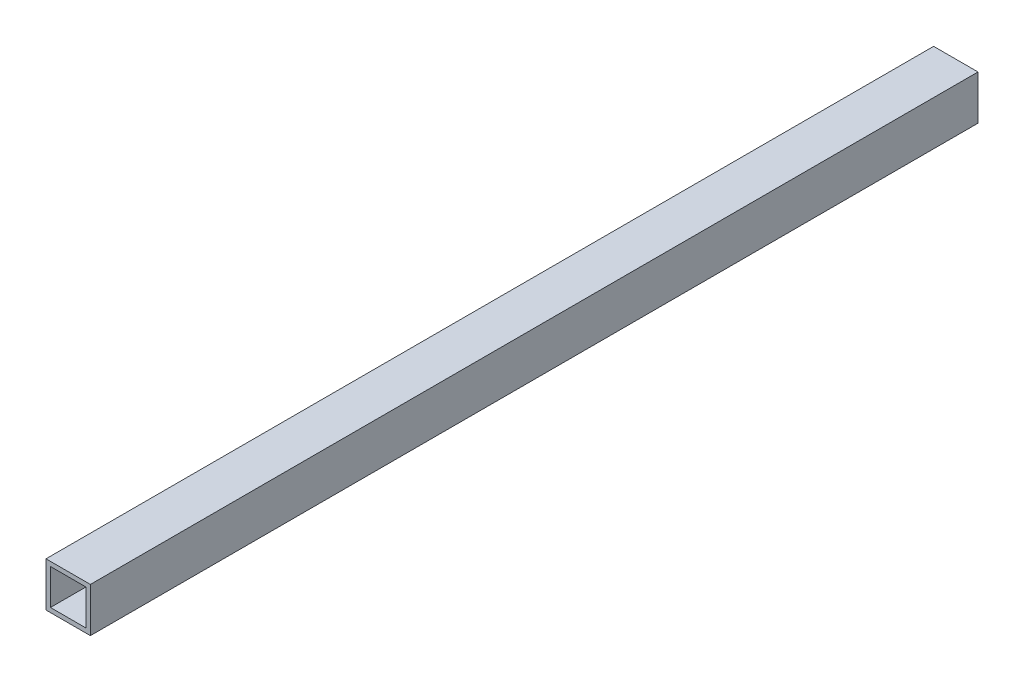
ISO-10303-21;
HEADER;
FILE_DESCRIPTION(('STEP AP214'),'2;1');
FILE_NAME('part.step','',(''),(''),'','','');
FILE_SCHEMA(('AUTOMOTIVE_DESIGN { 1 0 10303 214 1 1 1 1 }'));
ENDSEC;
DATA;
#1=APPLICATION_CONTEXT('core data for automotive mechanical design processes');
#2=APPLICATION_PROTOCOL_DEFINITION('international standard','automotive_design',2000,#1);
#3=PRODUCT_CONTEXT('',#1,'mechanical');
#4=PRODUCT('Part','Part','',(#3));
#5=PRODUCT_RELATED_PRODUCT_CATEGORY('part','',(#4));
#6=PRODUCT_DEFINITION_FORMATION('','',#4);
#7=PRODUCT_DEFINITION_CONTEXT('part definition',#1,'design');
#8=PRODUCT_DEFINITION('design','',#6,#7);
#9=PRODUCT_DEFINITION_SHAPE('','',#8);
#10=(LENGTH_UNIT() NAMED_UNIT(*) SI_UNIT(.MILLI.,.METRE.));
#11=(NAMED_UNIT(*) PLANE_ANGLE_UNIT() SI_UNIT($,.RADIAN.));
#12=(NAMED_UNIT(*) SI_UNIT($,.STERADIAN.) SOLID_ANGLE_UNIT());
#13=UNCERTAINTY_MEASURE_WITH_UNIT(LENGTH_MEASURE(1.E-05),#10,'distance_accuracy_value','');
#14=(GEOMETRIC_REPRESENTATION_CONTEXT(3) GLOBAL_UNCERTAINTY_ASSIGNED_CONTEXT((#13)) GLOBAL_UNIT_ASSIGNED_CONTEXT((#10,
#11,#12)) REPRESENTATION_CONTEXT('',''));
#15=CARTESIAN_POINT('',(0.,0.,0.));
#16=DIRECTION('',(0.,0.,1.));
#17=DIRECTION('',(1.,0.,0.));
#18=AXIS2_PLACEMENT_3D('',#15,#16,#17);
#19=CARTESIAN_POINT('',(0.,0.,300.));
#20=DIRECTION('',(0.,0.,1.));
#21=DIRECTION('',(1.,0.,0.));
#22=AXIS2_PLACEMENT_3D('',#19,#20,#21);
#23=PLANE('',#22);
#24=DIRECTION('',(0.,1.,0.));
#25=VECTOR('',#24,1.);
#26=CARTESIAN_POINT('',(7.5,6.,300.));
#27=LINE('',#26,#25);
#28=CARTESIAN_POINT('',(7.5,-7.5,300.));
#29=VERTEX_POINT('',#28);
#30=CARTESIAN_POINT('',(7.5,7.5,300.));
#31=VERTEX_POINT('',#30);
#32=EDGE_CURVE('E157',#29,#31,#27,.T.);
#33=ORIENTED_EDGE('',*,*,#32,.T.);
#34=DIRECTION('',(-1.,0.,0.));
#35=VECTOR('',#34,1.);
#36=CARTESIAN_POINT('',(-6.,7.5,300.));
#37=LINE('',#36,#35);
#38=CARTESIAN_POINT('',(-7.5,7.5,300.));
#39=VERTEX_POINT('',#38);
#40=EDGE_CURVE('E160',#31,#39,#37,.T.);
#41=ORIENTED_EDGE('',*,*,#40,.T.);
#42=DIRECTION('',(0.,-1.,0.));
#43=VECTOR('',#42,1.);
#44=CARTESIAN_POINT('',(-7.5,6.,300.));
#45=LINE('',#44,#43);
#46=CARTESIAN_POINT('',(-7.5,-7.5,300.));
#47=VERTEX_POINT('',#46);
#48=EDGE_CURVE('E163',#39,#47,#45,.T.);
#49=ORIENTED_EDGE('',*,*,#48,.T.);
#50=DIRECTION('',(1.,0.,0.));
#51=VECTOR('',#50,1.);
#52=CARTESIAN_POINT('',(-6.,-7.5,300.));
#53=LINE('',#52,#51);
#54=EDGE_CURVE('E165',#47,#29,#53,.T.);
#55=ORIENTED_EDGE('',*,*,#54,.T.);
#56=EDGE_LOOP('',(#33,#41,#49,#55));
#57=FACE_BOUND('',#56,.T.);
#58=DIRECTION('',(-1.,0.,0.));
#59=VECTOR('',#58,1.);
#60=CARTESIAN_POINT('',(-6.,6.,300.));
#61=LINE('',#60,#59);
#62=CARTESIAN_POINT('',(6.,6.,300.));
#63=VERTEX_POINT('',#62);
#64=CARTESIAN_POINT('',(-6.,6.,300.));
#65=VERTEX_POINT('',#64);
#66=EDGE_CURVE('E129',#63,#65,#61,.T.);
#67=ORIENTED_EDGE('',*,*,#66,.F.);
#68=DIRECTION('',(0.,1.,0.));
#69=VECTOR('',#68,1.);
#70=CARTESIAN_POINT('',(6.,6.,300.));
#71=LINE('',#70,#69);
#72=CARTESIAN_POINT('',(6.,-6.,300.));
#73=VERTEX_POINT('',#72);
#74=EDGE_CURVE('E121',#73,#63,#71,.T.);
#75=ORIENTED_EDGE('',*,*,#74,.F.);
#76=DIRECTION('',(1.,0.,0.));
#77=VECTOR('',#76,1.);
#78=CARTESIAN_POINT('',(-6.,-6.,300.));
#79=LINE('',#78,#77);
#80=CARTESIAN_POINT('',(-6.,-6.,300.));
#81=VERTEX_POINT('',#80);
#82=EDGE_CURVE('E143',#81,#73,#79,.T.);
#83=ORIENTED_EDGE('',*,*,#82,.F.);
#84=DIRECTION('',(0.,-1.,0.));
#85=VECTOR('',#84,1.);
#86=CARTESIAN_POINT('',(-6.,6.,300.));
#87=LINE('',#86,#85);
#88=EDGE_CURVE('E141',#65,#81,#87,.T.);
#89=ORIENTED_EDGE('',*,*,#88,.F.);
#90=EDGE_LOOP('',(#67,#75,#83,#89));
#91=FACE_BOUND('',#90,.T.);
#92=ADVANCED_FACE('F56',(#57,#91),#23,.T.);
#93=CARTESIAN_POINT('',(0.,0.,0.));
#94=DIRECTION('',(0.,0.,1.));
#95=DIRECTION('',(1.,0.,0.));
#96=AXIS2_PLACEMENT_3D('',#93,#94,#95);
#97=PLANE('',#96);
#98=DIRECTION('',(0.,1.,0.));
#99=VECTOR('',#98,1.);
#100=CARTESIAN_POINT('',(7.5,6.,0.));
#101=LINE('',#100,#99);
#102=CARTESIAN_POINT('',(7.5,-7.5,0.));
#103=VERTEX_POINT('',#102);
#104=CARTESIAN_POINT('',(7.5,7.5,0.));
#105=VERTEX_POINT('',#104);
#106=EDGE_CURVE('E137',#103,#105,#101,.T.);
#107=ORIENTED_EDGE('',*,*,#106,.F.);
#108=DIRECTION('',(1.,0.,0.));
#109=VECTOR('',#108,1.);
#110=CARTESIAN_POINT('',(-6.,-7.5,0.));
#111=LINE('',#110,#109);
#112=CARTESIAN_POINT('',(-7.5,-7.5,0.));
#113=VERTEX_POINT('',#112);
#114=EDGE_CURVE('E161',#113,#103,#111,.T.);
#115=ORIENTED_EDGE('',*,*,#114,.F.);
#116=DIRECTION('',(0.,-1.,0.));
#117=VECTOR('',#116,1.);
#118=CARTESIAN_POINT('',(-7.5,6.,0.));
#119=LINE('',#118,#117);
#120=CARTESIAN_POINT('',(-7.5,7.5,0.));
#121=VERTEX_POINT('',#120);
#122=EDGE_CURVE('E172',#121,#113,#119,.T.);
#123=ORIENTED_EDGE('',*,*,#122,.F.);
#124=DIRECTION('',(-1.,0.,0.));
#125=VECTOR('',#124,1.);
#126=CARTESIAN_POINT('',(-6.,7.5,0.));
#127=LINE('',#126,#125);
#128=EDGE_CURVE('E170',#105,#121,#127,.T.);
#129=ORIENTED_EDGE('',*,*,#128,.F.);
#130=EDGE_LOOP('',(#107,#115,#123,#129));
#131=FACE_BOUND('',#130,.T.);
#132=DIRECTION('',(0.,1.,0.));
#133=VECTOR('',#132,1.);
#134=CARTESIAN_POINT('',(6.,6.,0.));
#135=LINE('',#134,#133);
#136=CARTESIAN_POINT('',(6.,-6.,0.));
#137=VERTEX_POINT('',#136);
#138=CARTESIAN_POINT('',(6.,6.,0.));
#139=VERTEX_POINT('',#138);
#140=EDGE_CURVE('E79',#137,#139,#135,.T.);
#141=ORIENTED_EDGE('',*,*,#140,.T.);
#142=DIRECTION('',(-1.,0.,0.));
#143=VECTOR('',#142,1.);
#144=CARTESIAN_POINT('',(-6.,6.,0.));
#145=LINE('',#144,#143);
#146=CARTESIAN_POINT('',(-6.,6.,0.));
#147=VERTEX_POINT('',#146);
#148=EDGE_CURVE('E136',#139,#147,#145,.T.);
#149=ORIENTED_EDGE('',*,*,#148,.T.);
#150=DIRECTION('',(0.,-1.,0.));
#151=VECTOR('',#150,1.);
#152=CARTESIAN_POINT('',(-6.,6.,0.));
#153=LINE('',#152,#151);
#154=CARTESIAN_POINT('',(-6.,-6.,0.));
#155=VERTEX_POINT('',#154);
#156=EDGE_CURVE('E149',#147,#155,#153,.T.);
#157=ORIENTED_EDGE('',*,*,#156,.T.);
#158=DIRECTION('',(1.,0.,0.));
#159=VECTOR('',#158,1.);
#160=CARTESIAN_POINT('',(-6.,-6.,0.));
#161=LINE('',#160,#159);
#162=EDGE_CURVE('E130',#155,#137,#161,.T.);
#163=ORIENTED_EDGE('',*,*,#162,.T.);
#164=EDGE_LOOP('',(#141,#149,#157,#163));
#165=FACE_BOUND('',#164,.T.);
#166=ADVANCED_FACE('F190',(#131,#165),#97,.F.);
#167=CARTESIAN_POINT('',(7.5,6.,300.));
#168=DIRECTION('',(-1.,0.,0.));
#169=DIRECTION('',(0.,-1.,0.));
#170=AXIS2_PLACEMENT_3D('',#167,#168,#169);
#171=PLANE('',#170);
#172=ORIENTED_EDGE('',*,*,#106,.T.);
#173=DIRECTION('',(0.,0.,-1.));
#174=VECTOR('',#173,1.);
#175=CARTESIAN_POINT('',(7.5,7.5,300.));
#176=LINE('',#175,#174);
#177=EDGE_CURVE('E12',#31,#105,#176,.T.);
#178=ORIENTED_EDGE('',*,*,#177,.F.);
#179=ORIENTED_EDGE('',*,*,#32,.F.);
#180=DIRECTION('',(0.,0.,-1.));
#181=VECTOR('',#180,1.);
#182=CARTESIAN_POINT('',(7.5,-7.5,300.));
#183=LINE('',#182,#181);
#184=EDGE_CURVE('E167',#29,#103,#183,.T.);
#185=ORIENTED_EDGE('',*,*,#184,.T.);
#186=EDGE_LOOP('',(#172,#178,#179,#185));
#187=FACE_BOUND('',#186,.T.);
#188=ADVANCED_FACE('F58',(#187),#171,.F.);
#189=CARTESIAN_POINT('',(-6.,7.5,300.));
#190=DIRECTION('',(0.,-1.,0.));
#191=DIRECTION('',(0.,0.,-1.));
#192=AXIS2_PLACEMENT_3D('',#189,#190,#191);
#193=PLANE('',#192);
#194=ORIENTED_EDGE('',*,*,#128,.T.);
#195=DIRECTION('',(0.,0.,-1.));
#196=VECTOR('',#195,1.);
#197=CARTESIAN_POINT('',(-7.5,7.5,300.));
#198=LINE('',#197,#196);
#199=EDGE_CURVE('E64',#39,#121,#198,.T.);
#200=ORIENTED_EDGE('',*,*,#199,.F.);
#201=ORIENTED_EDGE('',*,*,#40,.F.);
#202=ORIENTED_EDGE('',*,*,#177,.T.);
#203=EDGE_LOOP('',(#194,#200,#201,#202));
#204=FACE_BOUND('',#203,.T.);
#205=ADVANCED_FACE('F200',(#204),#193,.F.);
#206=CARTESIAN_POINT('',(-7.5,6.,300.));
#207=DIRECTION('',(1.,0.,0.));
#208=DIRECTION('',(0.,1.,0.));
#209=AXIS2_PLACEMENT_3D('',#206,#207,#208);
#210=PLANE('',#209);
#211=ORIENTED_EDGE('',*,*,#122,.T.);
#212=DIRECTION('',(0.,0.,-1.));
#213=VECTOR('',#212,1.);
#214=CARTESIAN_POINT('',(-7.5,-7.5,300.));
#215=LINE('',#214,#213);
#216=EDGE_CURVE('E177',#47,#113,#215,.T.);
#217=ORIENTED_EDGE('',*,*,#216,.F.);
#218=ORIENTED_EDGE('',*,*,#48,.F.);
#219=ORIENTED_EDGE('',*,*,#199,.T.);
#220=EDGE_LOOP('',(#211,#217,#218,#219));
#221=FACE_BOUND('',#220,.T.);
#222=ADVANCED_FACE('F184',(#221),#210,.F.);
#223=CARTESIAN_POINT('',(-6.,-7.5,300.));
#224=DIRECTION('',(0.,1.,0.));
#225=DIRECTION('',(0.,0.,1.));
#226=AXIS2_PLACEMENT_3D('',#223,#224,#225);
#227=PLANE('',#226);
#228=ORIENTED_EDGE('',*,*,#114,.T.);
#229=ORIENTED_EDGE('',*,*,#184,.F.);
#230=ORIENTED_EDGE('',*,*,#54,.F.);
#231=ORIENTED_EDGE('',*,*,#216,.T.);
#232=EDGE_LOOP('',(#228,#229,#230,#231));
#233=FACE_BOUND('',#232,.T.);
#234=ADVANCED_FACE('F194',(#233),#227,.F.);
#235=CARTESIAN_POINT('',(6.,6.,300.));
#236=DIRECTION('',(-1.,0.,0.));
#237=DIRECTION('',(0.,-1.,0.));
#238=AXIS2_PLACEMENT_3D('',#235,#236,#237);
#239=PLANE('',#238);
#240=ORIENTED_EDGE('',*,*,#140,.F.);
#241=DIRECTION('',(0.,0.,-1.));
#242=VECTOR('',#241,1.);
#243=CARTESIAN_POINT('',(6.,-6.,300.));
#244=LINE('',#243,#242);
#245=EDGE_CURVE('E125',#73,#137,#244,.T.);
#246=ORIENTED_EDGE('',*,*,#245,.F.);
#247=ORIENTED_EDGE('',*,*,#74,.T.);
#248=DIRECTION('',(0.,0.,-1.));
#249=VECTOR('',#248,1.);
#250=CARTESIAN_POINT('',(6.,6.,300.));
#251=LINE('',#250,#249);
#252=EDGE_CURVE('E124',#63,#139,#251,.T.);
#253=ORIENTED_EDGE('',*,*,#252,.T.);
#254=EDGE_LOOP('',(#240,#246,#247,#253));
#255=FACE_BOUND('',#254,.T.);
#256=ADVANCED_FACE('F123',(#255),#239,.T.);
#257=CARTESIAN_POINT('',(-6.,6.,300.));
#258=DIRECTION('',(0.,-1.,0.));
#259=DIRECTION('',(0.,0.,-1.));
#260=AXIS2_PLACEMENT_3D('',#257,#258,#259);
#261=PLANE('',#260);
#262=ORIENTED_EDGE('',*,*,#148,.F.);
#263=ORIENTED_EDGE('',*,*,#252,.F.);
#264=ORIENTED_EDGE('',*,*,#66,.T.);
#265=DIRECTION('',(0.,0.,-1.));
#266=VECTOR('',#265,1.);
#267=CARTESIAN_POINT('',(-6.,6.,300.));
#268=LINE('',#267,#266);
#269=EDGE_CURVE('E138',#65,#147,#268,.T.);
#270=ORIENTED_EDGE('',*,*,#269,.T.);
#271=EDGE_LOOP('',(#262,#263,#264,#270));
#272=FACE_BOUND('',#271,.T.);
#273=ADVANCED_FACE('F133',(#272),#261,.T.);
#274=CARTESIAN_POINT('',(-6.,6.,300.));
#275=DIRECTION('',(1.,0.,0.));
#276=DIRECTION('',(0.,1.,0.));
#277=AXIS2_PLACEMENT_3D('',#274,#275,#276);
#278=PLANE('',#277);
#279=ORIENTED_EDGE('',*,*,#156,.F.);
#280=ORIENTED_EDGE('',*,*,#269,.F.);
#281=ORIENTED_EDGE('',*,*,#88,.T.);
#282=DIRECTION('',(0.,0.,-1.));
#283=VECTOR('',#282,1.);
#284=CARTESIAN_POINT('',(-6.,-6.,300.));
#285=LINE('',#284,#283);
#286=EDGE_CURVE('E71',#81,#155,#285,.T.);
#287=ORIENTED_EDGE('',*,*,#286,.T.);
#288=EDGE_LOOP('',(#279,#280,#281,#287));
#289=FACE_BOUND('',#288,.T.);
#290=ADVANCED_FACE('F223',(#289),#278,.T.);
#291=CARTESIAN_POINT('',(-6.,-6.,300.));
#292=DIRECTION('',(0.,1.,0.));
#293=DIRECTION('',(0.,0.,1.));
#294=AXIS2_PLACEMENT_3D('',#291,#292,#293);
#295=PLANE('',#294);
#296=ORIENTED_EDGE('',*,*,#162,.F.);
#297=ORIENTED_EDGE('',*,*,#286,.F.);
#298=ORIENTED_EDGE('',*,*,#82,.T.);
#299=ORIENTED_EDGE('',*,*,#245,.T.);
#300=EDGE_LOOP('',(#296,#297,#298,#299));
#301=FACE_BOUND('',#300,.T.);
#302=ADVANCED_FACE('F227',(#301),#295,.T.);
#303=CLOSED_SHELL('',(#92,#166,#188,#205,#222,#234,#256,#273,#290,#302));
#304=MANIFOLD_SOLID_BREP('B2',#303);
#305=ADVANCED_BREP_SHAPE_REPRESENTATION('',(#18,#304),#14);
#306=SHAPE_DEFINITION_REPRESENTATION(#9,#305);
ENDSEC;
END-ISO-10303-21;
